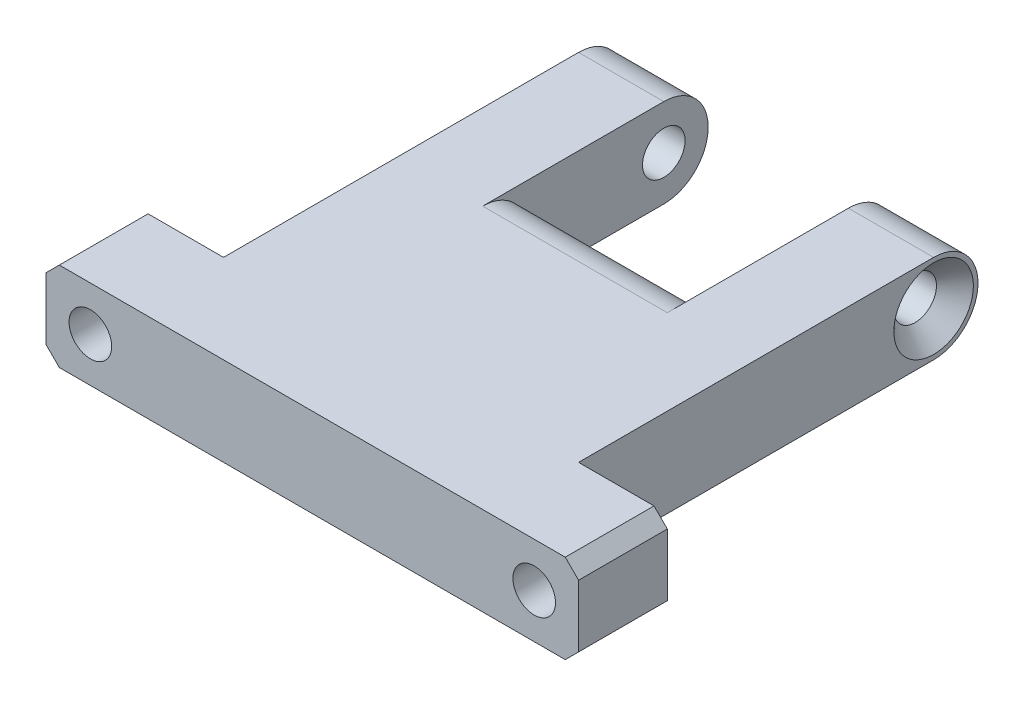
ISO-10303-21;
HEADER;
FILE_DESCRIPTION(('STEP AP214'),'2;1');
FILE_NAME('part.step','',(''),(''),'','','');
FILE_SCHEMA(('AUTOMOTIVE_DESIGN { 1 0 10303 214 1 1 1 1 }'));
ENDSEC;
DATA;
#1=APPLICATION_CONTEXT('core data for automotive mechanical design processes');
#2=APPLICATION_PROTOCOL_DEFINITION('international standard','automotive_design',2000,#1);
#3=PRODUCT_CONTEXT('',#1,'mechanical');
#4=PRODUCT('Part','Part','',(#3));
#5=PRODUCT_RELATED_PRODUCT_CATEGORY('part','',(#4));
#6=PRODUCT_DEFINITION_FORMATION('','',#4);
#7=PRODUCT_DEFINITION_CONTEXT('part definition',#1,'design');
#8=PRODUCT_DEFINITION('design','',#6,#7);
#9=PRODUCT_DEFINITION_SHAPE('','',#8);
#10=(LENGTH_UNIT() NAMED_UNIT(*) SI_UNIT(.MILLI.,.METRE.));
#11=(NAMED_UNIT(*) PLANE_ANGLE_UNIT() SI_UNIT($,.RADIAN.));
#12=(NAMED_UNIT(*) SI_UNIT($,.STERADIAN.) SOLID_ANGLE_UNIT());
#13=UNCERTAINTY_MEASURE_WITH_UNIT(LENGTH_MEASURE(1.E-05),#10,'distance_accuracy_value','');
#14=(GEOMETRIC_REPRESENTATION_CONTEXT(3) GLOBAL_UNCERTAINTY_ASSIGNED_CONTEXT((#13)) GLOBAL_UNIT_ASSIGNED_CONTEXT((#10,
#11,#12)) REPRESENTATION_CONTEXT('',''));
#15=CARTESIAN_POINT('',(0.,0.,0.));
#16=DIRECTION('',(0.,0.,1.));
#17=DIRECTION('',(1.,0.,0.));
#18=AXIS2_PLACEMENT_3D('',#15,#16,#17);
#19=CARTESIAN_POINT('',(-20.,10.,0.));
#20=DIRECTION('',(1.,0.,0.));
#21=DIRECTION('',(0.,0.,-1.));
#22=AXIS2_PLACEMENT_3D('',#19,#20,#21);
#23=PLANE('',#22);
#24=CARTESIAN_POINT('',(-20.,5.,-22.5));
#25=DIRECTION('',(1.,0.,0.));
#26=DIRECTION('',(0.,0.,-1.));
#27=AXIS2_PLACEMENT_3D('',#24,#25,#26);
#28=CIRCLE('',#27,5.);
#29=CARTESIAN_POINT('',(-20.,10.,-22.5));
#30=VERTEX_POINT('',#29);
#31=CARTESIAN_POINT('',(-20.,5.,-27.5));
#32=VERTEX_POINT('',#31);
#33=EDGE_CURVE('E241',#30,#32,#28,.F.);
#34=ORIENTED_EDGE('',*,*,#33,.T.);
#35=CARTESIAN_POINT('',(-20.,5.,-22.5));
#36=DIRECTION('',(1.,0.,0.));
#37=DIRECTION('',(0.,0.,-1.));
#38=AXIS2_PLACEMENT_3D('',#35,#36,#37);
#39=CIRCLE('',#38,5.);
#40=CARTESIAN_POINT('',(-20.,0.,-22.5));
#41=VERTEX_POINT('',#40);
#42=EDGE_CURVE('E244',#32,#41,#39,.F.);
#43=ORIENTED_EDGE('',*,*,#42,.T.);
#44=DIRECTION('',(0.,0.,1.));
#45=VECTOR('',#44,1.);
#46=CARTESIAN_POINT('',(-20.,0.,0.));
#47=LINE('',#46,#45);
#48=CARTESIAN_POINT('',(-20.,0.,17.5));
#49=VERTEX_POINT('',#48);
#50=EDGE_CURVE('E204',#41,#49,#47,.T.);
#51=ORIENTED_EDGE('',*,*,#50,.T.);
#52=DIRECTION('',(0.,-1.,0.));
#53=VECTOR('',#52,1.);
#54=CARTESIAN_POINT('',(-20.,10.,17.5));
#55=LINE('',#54,#53);
#56=CARTESIAN_POINT('',(-20.,10.,17.5));
#57=VERTEX_POINT('',#56);
#58=EDGE_CURVE('E183',#57,#49,#55,.T.);
#59=ORIENTED_EDGE('',*,*,#58,.F.);
#60=DIRECTION('',(0.,0.,1.));
#61=VECTOR('',#60,1.);
#62=CARTESIAN_POINT('',(-20.,10.,0.));
#63=LINE('',#62,#61);
#64=EDGE_CURVE('E189',#30,#57,#63,.T.);
#65=ORIENTED_EDGE('',*,*,#64,.F.);
#66=EDGE_LOOP('',(#34,#43,#51,#59,#65));
#67=FACE_BOUND('',#66,.T.);
#68=CARTESIAN_POINT('',(-20.,5.,-22.5));
#69=DIRECTION('',(-1.,0.,0.));
#70=DIRECTION('',(0.,0.,1.));
#71=AXIS2_PLACEMENT_3D('',#68,#69,#70);
#72=CIRCLE('',#71,4.48);
#73=CARTESIAN_POINT('',(-20.,5.,-18.02));
#74=VERTEX_POINT('',#73);
#75=EDGE_CURVE('E451',#74,#74,#72,.T.);
#76=ORIENTED_EDGE('',*,*,#75,.F.);
#77=EDGE_LOOP('',(#76));
#78=FACE_BOUND('',#77,.T.);
#79=ADVANCED_FACE('F43',(#67,#78),#23,.F.);
#80=CARTESIAN_POINT('',(0.,10.,17.5));
#81=DIRECTION('',(0.,0.,1.));
#82=DIRECTION('',(1.,0.,0.));
#83=AXIS2_PLACEMENT_3D('',#80,#81,#82);
#84=PLANE('',#83);
#85=DIRECTION('',(-1.,0.,0.));
#86=VECTOR('',#85,1.);
#87=CARTESIAN_POINT('',(0.,10.,17.5));
#88=LINE('',#87,#86);
#89=CARTESIAN_POINT('',(28.5,10.,17.5));
#90=VERTEX_POINT('',#89);
#91=CARTESIAN_POINT('',(20.,10.,17.5));
#92=VERTEX_POINT('',#91);
#93=EDGE_CURVE('E414',#90,#92,#88,.T.);
#94=ORIENTED_EDGE('',*,*,#93,.F.);
#95=DIRECTION('',(0.707106781186544,-0.707106781186551,0.));
#96=VECTOR('',#95,1.);
#97=CARTESIAN_POINT('',(28.5,10.,17.5));
#98=LINE('',#97,#96);
#99=CARTESIAN_POINT('',(30.,8.49999999999999,17.5));
#100=VERTEX_POINT('',#99);
#101=EDGE_CURVE('E68',#90,#100,#98,.T.);
#102=ORIENTED_EDGE('',*,*,#101,.T.);
#103=DIRECTION('',(0.,-1.,0.));
#104=VECTOR('',#103,1.);
#105=CARTESIAN_POINT('',(30.,10.,17.5));
#106=LINE('',#105,#104);
#107=CARTESIAN_POINT('',(30.,1.5,17.5));
#108=VERTEX_POINT('',#107);
#109=EDGE_CURVE('E331',#100,#108,#106,.T.);
#110=ORIENTED_EDGE('',*,*,#109,.T.);
#111=DIRECTION('',(0.707106781186549,0.707106781186546,0.));
#112=VECTOR('',#111,1.);
#113=CARTESIAN_POINT('',(30.,1.5,17.5));
#114=LINE('',#113,#112);
#115=CARTESIAN_POINT('',(28.5,0.,17.5));
#116=VERTEX_POINT('',#115);
#117=EDGE_CURVE('E60',#108,#116,#114,.F.);
#118=ORIENTED_EDGE('',*,*,#117,.T.);
#119=DIRECTION('',(-1.,0.,0.));
#120=VECTOR('',#119,1.);
#121=CARTESIAN_POINT('',(0.,0.,17.5));
#122=LINE('',#121,#120);
#123=CARTESIAN_POINT('',(20.,0.,17.5));
#124=VERTEX_POINT('',#123);
#125=EDGE_CURVE('E373',#116,#124,#122,.T.);
#126=ORIENTED_EDGE('',*,*,#125,.T.);
#127=DIRECTION('',(0.,-1.,0.));
#128=VECTOR('',#127,1.);
#129=CARTESIAN_POINT('',(20.,10.,17.5));
#130=LINE('',#129,#128);
#131=EDGE_CURVE('E340',#92,#124,#130,.T.);
#132=ORIENTED_EDGE('',*,*,#131,.F.);
#133=EDGE_LOOP('',(#94,#102,#110,#118,#126,#132));
#134=FACE_BOUND('',#133,.T.);
#135=CARTESIAN_POINT('',(25.,5.,17.5));
#136=DIRECTION('',(0.,0.,-1.));
#137=DIRECTION('',(-1.,0.,0.));
#138=AXIS2_PLACEMENT_3D('',#135,#136,#137);
#139=CIRCLE('',#138,4.48);
#140=CARTESIAN_POINT('',(20.52,5.,17.5));
#141=VERTEX_POINT('',#140);
#142=EDGE_CURVE('E439',#141,#141,#139,.T.);
#143=ORIENTED_EDGE('',*,*,#142,.F.);
#144=EDGE_LOOP('',(#143));
#145=FACE_BOUND('',#144,.T.);
#146=ADVANCED_FACE('F336',(#134,#145),#84,.F.);
#147=CARTESIAN_POINT('',(0.,10.,17.5));
#148=DIRECTION('',(0.,0.,-1.));
#149=DIRECTION('',(-1.,0.,0.));
#150=AXIS2_PLACEMENT_3D('',#147,#148,#149);
#151=PLANE('',#150);
#152=CARTESIAN_POINT('',(-25.,5.,17.5));
#153=DIRECTION('',(0.,0.,-1.));
#154=DIRECTION('',(-1.,0.,0.));
#155=AXIS2_PLACEMENT_3D('',#152,#153,#154);
#156=CIRCLE('',#155,4.48);
#157=CARTESIAN_POINT('',(-29.48,5.,17.5));
#158=VERTEX_POINT('',#157);
#159=EDGE_CURVE('E427',#158,#158,#156,.T.);
#160=ORIENTED_EDGE('',*,*,#159,.F.);
#161=EDGE_LOOP('',(#160));
#162=FACE_BOUND('',#161,.T.);
#163=DIRECTION('',(0.,-1.,0.));
#164=VECTOR('',#163,1.);
#165=CARTESIAN_POINT('',(-30.,10.,17.5));
#166=LINE('',#165,#164);
#167=CARTESIAN_POINT('',(-30.,8.50000000000001,17.5));
#168=VERTEX_POINT('',#167);
#169=CARTESIAN_POINT('',(-30.,1.50000000000001,17.5));
#170=VERTEX_POINT('',#169);
#171=EDGE_CURVE('E207',#168,#170,#166,.T.);
#172=ORIENTED_EDGE('',*,*,#171,.F.);
#173=DIRECTION('',(-0.707106781186549,-0.707106781186546,0.));
#174=VECTOR('',#173,1.);
#175=CARTESIAN_POINT('',(-14.2499999999999,24.25,17.5));
#176=LINE('',#175,#174);
#177=CARTESIAN_POINT('',(-28.5,10.,17.5));
#178=VERTEX_POINT('',#177);
#179=EDGE_CURVE('E184',#168,#178,#176,.F.);
#180=ORIENTED_EDGE('',*,*,#179,.T.);
#181=DIRECTION('',(1.,0.,0.));
#182=VECTOR('',#181,1.);
#183=CARTESIAN_POINT('',(0.,10.,17.5));
#184=LINE('',#183,#182);
#185=EDGE_CURVE('E177',#178,#57,#184,.T.);
#186=ORIENTED_EDGE('',*,*,#185,.T.);
#187=ORIENTED_EDGE('',*,*,#58,.T.);
#188=DIRECTION('',(1.,0.,0.));
#189=VECTOR('',#188,1.);
#190=CARTESIAN_POINT('',(0.,0.,17.5));
#191=LINE('',#190,#189);
#192=CARTESIAN_POINT('',(-28.5,0.,17.5));
#193=VERTEX_POINT('',#192);
#194=EDGE_CURVE('E367',#193,#49,#191,.T.);
#195=ORIENTED_EDGE('',*,*,#194,.F.);
#196=DIRECTION('',(-0.707106781186544,0.707106781186551,0.));
#197=VECTOR('',#196,1.);
#198=CARTESIAN_POINT('',(-19.2500000000001,-9.24999999999996,17.5));
#199=LINE('',#198,#197);
#200=EDGE_CURVE('E293',#193,#170,#199,.T.);
#201=ORIENTED_EDGE('',*,*,#200,.T.);
#202=EDGE_LOOP('',(#172,#180,#186,#187,#195,#201));
#203=FACE_BOUND('',#202,.T.);
#204=ADVANCED_FACE('F180',(#162,#203),#151,.T.);
#205=CARTESIAN_POINT('',(-30.,10.,0.));
#206=DIRECTION('',(-1.,0.,0.));
#207=DIRECTION('',(0.,0.,1.));
#208=AXIS2_PLACEMENT_3D('',#205,#206,#207);
#209=PLANE('',#208);
#210=DIRECTION('',(0.,-1.,0.));
#211=VECTOR('',#210,1.);
#212=CARTESIAN_POINT('',(-30.,10.,27.5));
#213=LINE('',#212,#211);
#214=CARTESIAN_POINT('',(-30.,8.50000000000001,27.5));
#215=VERTEX_POINT('',#214);
#216=CARTESIAN_POINT('',(-30.,1.50000000000001,27.5));
#217=VERTEX_POINT('',#216);
#218=EDGE_CURVE('E213',#215,#217,#213,.T.);
#219=ORIENTED_EDGE('',*,*,#218,.F.);
#220=DIRECTION('',(0.,0.,-1.));
#221=VECTOR('',#220,1.);
#222=CARTESIAN_POINT('',(-30.,8.50000000000001,0.));
#223=LINE('',#222,#221);
#224=EDGE_CURVE('E289',#215,#168,#223,.T.);
#225=ORIENTED_EDGE('',*,*,#224,.T.);
#226=ORIENTED_EDGE('',*,*,#171,.T.);
#227=DIRECTION('',(0.,0.,1.));
#228=VECTOR('',#227,1.);
#229=CARTESIAN_POINT('',(-30.,1.50000000000001,27.5));
#230=LINE('',#229,#228);
#231=EDGE_CURVE('E273',#170,#217,#230,.T.);
#232=ORIENTED_EDGE('',*,*,#231,.T.);
#233=EDGE_LOOP('',(#219,#225,#226,#232));
#234=FACE_BOUND('',#233,.T.);
#235=ADVANCED_FACE('F570',(#234),#209,.T.);
#236=CARTESIAN_POINT('',(0.,10.,27.5));
#237=DIRECTION('',(0.,0.,-1.));
#238=DIRECTION('',(-1.,0.,0.));
#239=AXIS2_PLACEMENT_3D('',#236,#237,#238);
#240=PLANE('',#239);
#241=CARTESIAN_POINT('',(25.,5.,27.5));
#242=DIRECTION('',(0.,0.,-1.));
#243=DIRECTION('',(-1.,0.,0.));
#244=AXIS2_PLACEMENT_3D('',#241,#242,#243);
#245=CIRCLE('',#244,2.4);
#246=CARTESIAN_POINT('',(22.6,5.,27.5));
#247=VERTEX_POINT('',#246);
#248=EDGE_CURVE('E431',#247,#247,#245,.T.);
#249=ORIENTED_EDGE('',*,*,#248,.T.);
#250=EDGE_LOOP('',(#249));
#251=FACE_BOUND('',#250,.T.);
#252=CARTESIAN_POINT('',(-25.,5.,27.5));
#253=DIRECTION('',(0.,0.,-1.));
#254=DIRECTION('',(-1.,0.,0.));
#255=AXIS2_PLACEMENT_3D('',#252,#253,#254);
#256=CIRCLE('',#255,2.4);
#257=CARTESIAN_POINT('',(-27.4,5.,27.5));
#258=VERTEX_POINT('',#257);
#259=EDGE_CURVE('E286',#258,#258,#256,.T.);
#260=ORIENTED_EDGE('',*,*,#259,.T.);
#261=EDGE_LOOP('',(#260));
#262=FACE_BOUND('',#261,.T.);
#263=DIRECTION('',(1.,0.,0.));
#264=VECTOR('',#263,1.);
#265=CARTESIAN_POINT('',(0.,10.,27.5));
#266=LINE('',#265,#264);
#267=CARTESIAN_POINT('',(-28.5,10.,27.5));
#268=VERTEX_POINT('',#267);
#269=CARTESIAN_POINT('',(28.5,10.,27.5));
#270=VERTEX_POINT('',#269);
#271=EDGE_CURVE('E188',#268,#270,#266,.T.);
#272=ORIENTED_EDGE('',*,*,#271,.F.);
#273=DIRECTION('',(0.707106781186549,0.707106781186546,0.));
#274=VECTOR('',#273,1.);
#275=CARTESIAN_POINT('',(-30.,8.50000000000001,27.5));
#276=LINE('',#275,#274);
#277=EDGE_CURVE('E314',#268,#215,#276,.F.);
#278=ORIENTED_EDGE('',*,*,#277,.T.);
#279=ORIENTED_EDGE('',*,*,#218,.T.);
#280=DIRECTION('',(0.707106781186544,-0.707106781186551,0.));
#281=VECTOR('',#280,1.);
#282=CARTESIAN_POINT('',(-28.5,0.,27.5));
#283=LINE('',#282,#281);
#284=CARTESIAN_POINT('',(-28.5,0.,27.5));
#285=VERTEX_POINT('',#284);
#286=EDGE_CURVE('E311',#217,#285,#283,.T.);
#287=ORIENTED_EDGE('',*,*,#286,.T.);
#288=DIRECTION('',(1.,0.,0.));
#289=VECTOR('',#288,1.);
#290=CARTESIAN_POINT('',(0.,0.,27.5));
#291=LINE('',#290,#289);
#292=CARTESIAN_POINT('',(28.5,0.,27.5));
#293=VERTEX_POINT('',#292);
#294=EDGE_CURVE('E368',#285,#293,#291,.T.);
#295=ORIENTED_EDGE('',*,*,#294,.T.);
#296=DIRECTION('',(-0.707106781186549,-0.707106781186546,0.));
#297=VECTOR('',#296,1.);
#298=CARTESIAN_POINT('',(30.,1.5,27.5));
#299=LINE('',#298,#297);
#300=CARTESIAN_POINT('',(30.,1.5,27.5));
#301=VERTEX_POINT('',#300);
#302=EDGE_CURVE('E305',#293,#301,#299,.F.);
#303=ORIENTED_EDGE('',*,*,#302,.T.);
#304=DIRECTION('',(0.,-1.,0.));
#305=VECTOR('',#304,1.);
#306=CARTESIAN_POINT('',(30.,10.,27.5));
#307=LINE('',#306,#305);
#308=CARTESIAN_POINT('',(30.,8.49999999999999,27.5));
#309=VERTEX_POINT('',#308);
#310=EDGE_CURVE('E334',#309,#301,#307,.T.);
#311=ORIENTED_EDGE('',*,*,#310,.F.);
#312=DIRECTION('',(-0.707106781186544,0.707106781186551,0.));
#313=VECTOR('',#312,1.);
#314=CARTESIAN_POINT('',(28.5,10.,27.5));
#315=LINE('',#314,#313);
#316=EDGE_CURVE('E308',#309,#270,#315,.T.);
#317=ORIENTED_EDGE('',*,*,#316,.T.);
#318=EDGE_LOOP('',(#272,#278,#279,#287,#295,#303,#311,#317));
#319=FACE_BOUND('',#318,.T.);
#320=ADVANCED_FACE('F355',(#251,#262,#319),#240,.F.);
#321=CARTESIAN_POINT('',(30.,10.,0.));
#322=DIRECTION('',(-1.,0.,0.));
#323=DIRECTION('',(0.,0.,1.));
#324=AXIS2_PLACEMENT_3D('',#321,#322,#323);
#325=PLANE('',#324);
#326=ORIENTED_EDGE('',*,*,#109,.F.);
#327=DIRECTION('',(0.,0.,1.));
#328=VECTOR('',#327,1.);
#329=CARTESIAN_POINT('',(30.,8.49999999999999,27.5));
#330=LINE('',#329,#328);
#331=EDGE_CURVE('E11',#100,#309,#330,.T.);
#332=ORIENTED_EDGE('',*,*,#331,.T.);
#333=ORIENTED_EDGE('',*,*,#310,.T.);
#334=DIRECTION('',(0.,0.,-1.));
#335=VECTOR('',#334,1.);
#336=CARTESIAN_POINT('',(30.,1.5,0.));
#337=LINE('',#336,#335);
#338=EDGE_CURVE('E53',#301,#108,#337,.T.);
#339=ORIENTED_EDGE('',*,*,#338,.T.);
#340=EDGE_LOOP('',(#326,#332,#333,#339));
#341=FACE_BOUND('',#340,.T.);
#342=ADVANCED_FACE('F330',(#341),#325,.F.);
#343=CARTESIAN_POINT('',(20.,10.,0.));
#344=DIRECTION('',(1.,0.,0.));
#345=DIRECTION('',(0.,0.,-1.));
#346=AXIS2_PLACEMENT_3D('',#343,#344,#345);
#347=PLANE('',#346);
#348=CARTESIAN_POINT('',(20.,5.,-22.5));
#349=DIRECTION('',(1.,0.,0.));
#350=DIRECTION('',(0.,0.,-1.));
#351=AXIS2_PLACEMENT_3D('',#348,#349,#350);
#352=CIRCLE('',#351,4.48);
#353=CARTESIAN_POINT('',(20.,5.,-26.98));
#354=VERTEX_POINT('',#353);
#355=EDGE_CURVE('E463',#354,#354,#352,.T.);
#356=ORIENTED_EDGE('',*,*,#355,.F.);
#357=EDGE_LOOP('',(#356));
#358=FACE_BOUND('',#357,.T.);
#359=DIRECTION('',(0.,0.,1.));
#360=VECTOR('',#359,1.);
#361=CARTESIAN_POINT('',(20.,0.,0.));
#362=LINE('',#361,#360);
#363=CARTESIAN_POINT('',(20.,0.,-22.5));
#364=VERTEX_POINT('',#363);
#365=EDGE_CURVE('E380',#364,#124,#362,.T.);
#366=ORIENTED_EDGE('',*,*,#365,.F.);
#367=CARTESIAN_POINT('',(20.,5.,-22.5));
#368=DIRECTION('',(1.,0.,0.));
#369=DIRECTION('',(0.,0.,-1.));
#370=AXIS2_PLACEMENT_3D('',#367,#368,#369);
#371=CIRCLE('',#370,5.);
#372=CARTESIAN_POINT('',(20.,5.,-27.5));
#373=VERTEX_POINT('',#372);
#374=EDGE_CURVE('E250',#364,#373,#371,.T.);
#375=ORIENTED_EDGE('',*,*,#374,.T.);
#376=CARTESIAN_POINT('',(20.,5.,-22.5));
#377=DIRECTION('',(1.,0.,0.));
#378=DIRECTION('',(0.,0.,-1.));
#379=AXIS2_PLACEMENT_3D('',#376,#377,#378);
#380=CIRCLE('',#379,5.);
#381=CARTESIAN_POINT('',(20.,10.,-22.5));
#382=VERTEX_POINT('',#381);
#383=EDGE_CURVE('E247',#373,#382,#380,.T.);
#384=ORIENTED_EDGE('',*,*,#383,.T.);
#385=DIRECTION('',(0.,0.,1.));
#386=VECTOR('',#385,1.);
#387=CARTESIAN_POINT('',(20.,10.,0.));
#388=LINE('',#387,#386);
#389=EDGE_CURVE('E408',#382,#92,#388,.T.);
#390=ORIENTED_EDGE('',*,*,#389,.T.);
#391=ORIENTED_EDGE('',*,*,#131,.T.);
#392=EDGE_LOOP('',(#366,#375,#384,#390,#391));
#393=FACE_BOUND('',#392,.T.);
#394=ADVANCED_FACE('F470',(#358,#393),#347,.T.);
#395=CARTESIAN_POINT('',(10.4,10.,0.));
#396=DIRECTION('',(-1.,0.,0.));
#397=DIRECTION('',(0.,0.,1.));
#398=AXIS2_PLACEMENT_3D('',#395,#396,#397);
#399=PLANE('',#398);
#400=CARTESIAN_POINT('',(10.4,5.,-22.5));
#401=DIRECTION('',(-1.,0.,0.));
#402=DIRECTION('',(0.,0.,1.));
#403=AXIS2_PLACEMENT_3D('',#400,#401,#402);
#404=CIRCLE('',#403,2.39999999999999);
#405=CARTESIAN_POINT('',(10.4,5.,-20.1));
#406=VERTEX_POINT('',#405);
#407=EDGE_CURVE('E455',#406,#406,#404,.T.);
#408=ORIENTED_EDGE('',*,*,#407,.F.);
#409=EDGE_LOOP('',(#408));
#410=FACE_BOUND('',#409,.T.);
#411=CARTESIAN_POINT('',(10.4,5.,-22.5));
#412=DIRECTION('',(-1.,0.,0.));
#413=DIRECTION('',(0.,0.,1.));
#414=AXIS2_PLACEMENT_3D('',#411,#412,#413);
#415=CIRCLE('',#414,5.);
#416=CARTESIAN_POINT('',(10.4,10.,-22.5));
#417=VERTEX_POINT('',#416);
#418=CARTESIAN_POINT('',(10.4,5.,-27.5));
#419=VERTEX_POINT('',#418);
#420=EDGE_CURVE('E253',#417,#419,#415,.T.);
#421=ORIENTED_EDGE('',*,*,#420,.T.);
#422=CARTESIAN_POINT('',(10.4,5.,-22.5));
#423=DIRECTION('',(-1.,0.,0.));
#424=DIRECTION('',(0.,0.,1.));
#425=AXIS2_PLACEMENT_3D('',#422,#423,#424);
#426=CIRCLE('',#425,5.);
#427=CARTESIAN_POINT('',(10.4,0.,-22.5));
#428=VERTEX_POINT('',#427);
#429=EDGE_CURVE('E256',#419,#428,#426,.T.);
#430=ORIENTED_EDGE('',*,*,#429,.T.);
#431=DIRECTION('',(0.,0.,-1.));
#432=VECTOR('',#431,1.);
#433=CARTESIAN_POINT('',(10.4,0.,0.));
#434=LINE('',#433,#432);
#435=CARTESIAN_POINT('',(10.4,0.,-2.10000000000001));
#436=VERTEX_POINT('',#435);
#437=EDGE_CURVE('E384',#436,#428,#434,.T.);
#438=ORIENTED_EDGE('',*,*,#437,.F.);
#439=CARTESIAN_POINT('',(10.4,5.,-2.10000000000001));
#440=DIRECTION('',(-1.,0.,0.));
#441=DIRECTION('',(0.,0.,1.));
#442=AXIS2_PLACEMENT_3D('',#439,#440,#441);
#443=CIRCLE('',#442,5.);
#444=CARTESIAN_POINT('',(10.4,5.,-7.10000000000001));
#445=VERTEX_POINT('',#444);
#446=EDGE_CURVE('E266',#436,#445,#443,.F.);
#447=ORIENTED_EDGE('',*,*,#446,.T.);
#448=CARTESIAN_POINT('',(10.4,5.,-2.10000000000001));
#449=DIRECTION('',(-1.,0.,0.));
#450=DIRECTION('',(0.,0.,1.));
#451=AXIS2_PLACEMENT_3D('',#448,#449,#450);
#452=CIRCLE('',#451,5.);
#453=CARTESIAN_POINT('',(10.4,10.,-2.10000000000001));
#454=VERTEX_POINT('',#453);
#455=EDGE_CURVE('E259',#445,#454,#452,.F.);
#456=ORIENTED_EDGE('',*,*,#455,.T.);
#457=DIRECTION('',(0.,0.,-1.));
#458=VECTOR('',#457,1.);
#459=CARTESIAN_POINT('',(10.4,10.,0.));
#460=LINE('',#459,#458);
#461=EDGE_CURVE('E405',#454,#417,#460,.T.);
#462=ORIENTED_EDGE('',*,*,#461,.T.);
#463=EDGE_LOOP('',(#421,#430,#438,#447,#456,#462));
#464=FACE_BOUND('',#463,.T.);
#465=ADVANCED_FACE('F473',(#410,#464),#399,.T.);
#466=CARTESIAN_POINT('',(-10.4,10.,0.));
#467=DIRECTION('',(-1.,0.,0.));
#468=DIRECTION('',(0.,0.,1.));
#469=AXIS2_PLACEMENT_3D('',#466,#467,#468);
#470=PLANE('',#469);
#471=CARTESIAN_POINT('',(-10.4,5.,-22.5));
#472=DIRECTION('',(-1.,0.,0.));
#473=DIRECTION('',(0.,0.,1.));
#474=AXIS2_PLACEMENT_3D('',#471,#472,#473);
#475=CIRCLE('',#474,2.39999999999999);
#476=CARTESIAN_POINT('',(-10.4,5.,-20.1));
#477=VERTEX_POINT('',#476);
#478=EDGE_CURVE('E443',#477,#477,#475,.T.);
#479=ORIENTED_EDGE('',*,*,#478,.T.);
#480=EDGE_LOOP('',(#479));
#481=FACE_BOUND('',#480,.T.);
#482=DIRECTION('',(0.,0.,-1.));
#483=VECTOR('',#482,1.);
#484=CARTESIAN_POINT('',(-10.4,0.,0.));
#485=LINE('',#484,#483);
#486=CARTESIAN_POINT('',(-10.4,0.,-2.10000000000001));
#487=VERTEX_POINT('',#486);
#488=CARTESIAN_POINT('',(-10.4,0.,-22.5));
#489=VERTEX_POINT('',#488);
#490=EDGE_CURVE('E199',#487,#489,#485,.T.);
#491=ORIENTED_EDGE('',*,*,#490,.T.);
#492=CARTESIAN_POINT('',(-10.4,5.,-22.5));
#493=DIRECTION('',(-1.,0.,0.));
#494=DIRECTION('',(0.,0.,1.));
#495=AXIS2_PLACEMENT_3D('',#492,#493,#494);
#496=CIRCLE('',#495,5.);
#497=CARTESIAN_POINT('',(-10.4,5.,-27.5));
#498=VERTEX_POINT('',#497);
#499=EDGE_CURVE('E238',#489,#498,#496,.F.);
#500=ORIENTED_EDGE('',*,*,#499,.T.);
#501=CARTESIAN_POINT('',(-10.4,5.,-22.5));
#502=DIRECTION('',(-1.,0.,0.));
#503=DIRECTION('',(0.,0.,1.));
#504=AXIS2_PLACEMENT_3D('',#501,#502,#503);
#505=CIRCLE('',#504,5.);
#506=CARTESIAN_POINT('',(-10.4,10.,-22.5));
#507=VERTEX_POINT('',#506);
#508=EDGE_CURVE('E235',#498,#507,#505,.F.);
#509=ORIENTED_EDGE('',*,*,#508,.T.);
#510=DIRECTION('',(0.,0.,-1.));
#511=VECTOR('',#510,1.);
#512=CARTESIAN_POINT('',(-10.4,10.,0.));
#513=LINE('',#512,#511);
#514=CARTESIAN_POINT('',(-10.4,10.,-2.10000000000001));
#515=VERTEX_POINT('',#514);
#516=EDGE_CURVE('E346',#515,#507,#513,.T.);
#517=ORIENTED_EDGE('',*,*,#516,.F.);
#518=CARTESIAN_POINT('',(-10.4,5.,-2.10000000000001));
#519=DIRECTION('',(-1.,0.,0.));
#520=DIRECTION('',(0.,0.,1.));
#521=AXIS2_PLACEMENT_3D('',#518,#519,#520);
#522=CIRCLE('',#521,5.);
#523=CARTESIAN_POINT('',(-10.4,5.,-7.10000000000001));
#524=VERTEX_POINT('',#523);
#525=EDGE_CURVE('E263',#515,#524,#522,.T.);
#526=ORIENTED_EDGE('',*,*,#525,.T.);
#527=CARTESIAN_POINT('',(-10.4,5.,-2.10000000000001));
#528=DIRECTION('',(-1.,0.,0.));
#529=DIRECTION('',(0.,0.,1.));
#530=AXIS2_PLACEMENT_3D('',#527,#528,#529);
#531=CIRCLE('',#530,5.);
#532=EDGE_CURVE('E269',#524,#487,#531,.T.);
#533=ORIENTED_EDGE('',*,*,#532,.T.);
#534=EDGE_LOOP('',(#491,#500,#509,#517,#526,#533));
#535=FACE_BOUND('',#534,.T.);
#536=ADVANCED_FACE('F390',(#481,#535),#470,.F.);
#537=CARTESIAN_POINT('',(0.,10.,0.));
#538=DIRECTION('',(0.,1.,0.));
#539=DIRECTION('',(0.,0.,1.));
#540=AXIS2_PLACEMENT_3D('',#537,#538,#539);
#541=PLANE('',#540);
#542=ORIENTED_EDGE('',*,*,#185,.F.);
#543=DIRECTION('',(0.,0.,1.));
#544=VECTOR('',#543,1.);
#545=CARTESIAN_POINT('',(-28.5,10.,0.));
#546=LINE('',#545,#544);
#547=EDGE_CURVE('E302',#178,#268,#546,.T.);
#548=ORIENTED_EDGE('',*,*,#547,.T.);
#549=ORIENTED_EDGE('',*,*,#271,.T.);
#550=DIRECTION('',(0.,0.,-1.));
#551=VECTOR('',#550,1.);
#552=CARTESIAN_POINT('',(28.5,10.,17.5));
#553=LINE('',#552,#551);
#554=EDGE_CURVE('E298',#270,#90,#553,.T.);
#555=ORIENTED_EDGE('',*,*,#554,.T.);
#556=ORIENTED_EDGE('',*,*,#93,.T.);
#557=ORIENTED_EDGE('',*,*,#389,.F.);
#558=DIRECTION('',(1.,0.,0.));
#559=VECTOR('',#558,1.);
#560=CARTESIAN_POINT('',(0.,10.,-22.5));
#561=LINE('',#560,#559);
#562=EDGE_CURVE('E206',#382,#417,#561,.F.);
#563=ORIENTED_EDGE('',*,*,#562,.T.);
#564=ORIENTED_EDGE('',*,*,#461,.F.);
#565=DIRECTION('',(1.,0.,0.));
#566=VECTOR('',#565,1.);
#567=CARTESIAN_POINT('',(0.,10.,-2.10000000000001));
#568=LINE('',#567,#566);
#569=EDGE_CURVE('E219',#454,#515,#568,.F.);
#570=ORIENTED_EDGE('',*,*,#569,.T.);
#571=ORIENTED_EDGE('',*,*,#516,.T.);
#572=DIRECTION('',(1.,0.,0.));
#573=VECTOR('',#572,1.);
#574=CARTESIAN_POINT('',(0.,10.,-22.5));
#575=LINE('',#574,#573);
#576=EDGE_CURVE('E195',#507,#30,#575,.F.);
#577=ORIENTED_EDGE('',*,*,#576,.T.);
#578=ORIENTED_EDGE('',*,*,#64,.T.);
#579=EDGE_LOOP('',(#542,#548,#549,#555,#556,#557,#563,#564,#570,#571,#577,#578));
#580=FACE_BOUND('',#579,.T.);
#581=ADVANCED_FACE('F192',(#580),#541,.T.);
#582=CARTESIAN_POINT('',(0.,0.,0.));
#583=DIRECTION('',(0.,1.,0.));
#584=DIRECTION('',(0.,0.,1.));
#585=AXIS2_PLACEMENT_3D('',#582,#583,#584);
#586=PLANE('',#585);
#587=ORIENTED_EDGE('',*,*,#294,.F.);
#588=DIRECTION('',(0.,0.,-1.));
#589=VECTOR('',#588,1.);
#590=CARTESIAN_POINT('',(-28.5,0.,17.5));
#591=LINE('',#590,#589);
#592=EDGE_CURVE('E320',#285,#193,#591,.T.);
#593=ORIENTED_EDGE('',*,*,#592,.T.);
#594=ORIENTED_EDGE('',*,*,#194,.T.);
#595=ORIENTED_EDGE('',*,*,#50,.F.);
#596=DIRECTION('',(1.,0.,0.));
#597=VECTOR('',#596,1.);
#598=CARTESIAN_POINT('',(-10.4,0.,-22.5));
#599=LINE('',#598,#597);
#600=EDGE_CURVE('E227',#41,#489,#599,.T.);
#601=ORIENTED_EDGE('',*,*,#600,.T.);
#602=ORIENTED_EDGE('',*,*,#490,.F.);
#603=DIRECTION('',(1.,0.,0.));
#604=VECTOR('',#603,1.);
#605=CARTESIAN_POINT('',(10.4,0.,-2.10000000000001));
#606=LINE('',#605,#604);
#607=EDGE_CURVE('E231',#487,#436,#606,.T.);
#608=ORIENTED_EDGE('',*,*,#607,.T.);
#609=ORIENTED_EDGE('',*,*,#437,.T.);
#610=DIRECTION('',(1.,0.,0.));
#611=VECTOR('',#610,1.);
#612=CARTESIAN_POINT('',(20.,0.,-22.5));
#613=LINE('',#612,#611);
#614=EDGE_CURVE('E223',#428,#364,#613,.T.);
#615=ORIENTED_EDGE('',*,*,#614,.T.);
#616=ORIENTED_EDGE('',*,*,#365,.T.);
#617=ORIENTED_EDGE('',*,*,#125,.F.);
#618=DIRECTION('',(0.,0.,1.));
#619=VECTOR('',#618,1.);
#620=CARTESIAN_POINT('',(28.5,0.,0.));
#621=LINE('',#620,#619);
#622=EDGE_CURVE('E317',#116,#293,#621,.T.);
#623=ORIENTED_EDGE('',*,*,#622,.T.);
#624=EDGE_LOOP('',(#587,#593,#594,#595,#601,#602,#608,#609,#615,#616,#617,#623));
#625=FACE_BOUND('',#624,.T.);
#626=ADVANCED_FACE('F366',(#625),#586,.F.);
#627=CARTESIAN_POINT('',(0.,5.,-2.10000000000001));
#628=DIRECTION('',(-1.,0.,0.));
#629=DIRECTION('',(0.,0.,1.));
#630=AXIS2_PLACEMENT_3D('',#627,#628,#629);
#631=CYLINDRICAL_SURFACE('',#630,5.);
#632=ORIENTED_EDGE('',*,*,#607,.F.);
#633=ORIENTED_EDGE('',*,*,#532,.F.);
#634=DIRECTION('',(1.,0.,0.));
#635=VECTOR('',#634,1.);
#636=CARTESIAN_POINT('',(-10.4,5.,-7.10000000000001));
#637=LINE('',#636,#635);
#638=EDGE_CURVE('E274',#445,#524,#637,.F.);
#639=ORIENTED_EDGE('',*,*,#638,.F.);
#640=ORIENTED_EDGE('',*,*,#446,.F.);
#641=EDGE_LOOP('',(#632,#633,#639,#640));
#642=FACE_BOUND('',#641,.T.);
#643=ADVANCED_FACE('F513',(#642),#631,.T.);
#644=CARTESIAN_POINT('',(0.,5.,-2.10000000000001));
#645=DIRECTION('',(1.,0.,0.));
#646=DIRECTION('',(0.,0.,-1.));
#647=AXIS2_PLACEMENT_3D('',#644,#645,#646);
#648=CYLINDRICAL_SURFACE('',#647,5.);
#649=ORIENTED_EDGE('',*,*,#525,.F.);
#650=ORIENTED_EDGE('',*,*,#569,.F.);
#651=ORIENTED_EDGE('',*,*,#455,.F.);
#652=ORIENTED_EDGE('',*,*,#638,.T.);
#653=EDGE_LOOP('',(#649,#650,#651,#652));
#654=FACE_BOUND('',#653,.T.);
#655=ADVANCED_FACE('F510',(#654),#648,.T.);
#656=CARTESIAN_POINT('',(0.,5.,-22.5));
#657=DIRECTION('',(1.,0.,0.));
#658=DIRECTION('',(0.,0.,-1.));
#659=AXIS2_PLACEMENT_3D('',#656,#657,#658);
#660=CYLINDRICAL_SURFACE('',#659,5.);
#661=DIRECTION('',(1.,0.,0.));
#662=VECTOR('',#661,1.);
#663=CARTESIAN_POINT('',(0.,5.,-27.5));
#664=LINE('',#663,#662);
#665=EDGE_CURVE('E278',#32,#498,#664,.T.);
#666=ORIENTED_EDGE('',*,*,#665,.F.);
#667=ORIENTED_EDGE('',*,*,#33,.F.);
#668=ORIENTED_EDGE('',*,*,#576,.F.);
#669=ORIENTED_EDGE('',*,*,#508,.F.);
#670=EDGE_LOOP('',(#666,#667,#668,#669));
#671=FACE_BOUND('',#670,.T.);
#672=ADVANCED_FACE('F401',(#671),#660,.T.);
#673=CARTESIAN_POINT('',(0.,5.,-22.5));
#674=DIRECTION('',(-1.,0.,0.));
#675=DIRECTION('',(0.,0.,1.));
#676=AXIS2_PLACEMENT_3D('',#673,#674,#675);
#677=CYLINDRICAL_SURFACE('',#676,5.);
#678=ORIENTED_EDGE('',*,*,#42,.F.);
#679=ORIENTED_EDGE('',*,*,#665,.T.);
#680=ORIENTED_EDGE('',*,*,#499,.F.);
#681=ORIENTED_EDGE('',*,*,#600,.F.);
#682=EDGE_LOOP('',(#678,#679,#680,#681));
#683=FACE_BOUND('',#682,.T.);
#684=ADVANCED_FACE('F398',(#683),#677,.T.);
#685=CARTESIAN_POINT('',(0.,5.,-22.5));
#686=DIRECTION('',(1.,0.,0.));
#687=DIRECTION('',(0.,0.,-1.));
#688=AXIS2_PLACEMENT_3D('',#685,#686,#687);
#689=CYLINDRICAL_SURFACE('',#688,5.);
#690=DIRECTION('',(1.,0.,0.));
#691=VECTOR('',#690,1.);
#692=CARTESIAN_POINT('',(0.,5.,-27.5));
#693=LINE('',#692,#691);
#694=EDGE_CURVE('E282',#419,#373,#693,.T.);
#695=ORIENTED_EDGE('',*,*,#694,.F.);
#696=ORIENTED_EDGE('',*,*,#420,.F.);
#697=ORIENTED_EDGE('',*,*,#562,.F.);
#698=ORIENTED_EDGE('',*,*,#383,.F.);
#699=EDGE_LOOP('',(#695,#696,#697,#698));
#700=FACE_BOUND('',#699,.T.);
#701=ADVANCED_FACE('F485',(#700),#689,.T.);
#702=CARTESIAN_POINT('',(0.,5.,-22.5));
#703=DIRECTION('',(-1.,0.,0.));
#704=DIRECTION('',(0.,0.,1.));
#705=AXIS2_PLACEMENT_3D('',#702,#703,#704);
#706=CYLINDRICAL_SURFACE('',#705,5.);
#707=ORIENTED_EDGE('',*,*,#429,.F.);
#708=ORIENTED_EDGE('',*,*,#694,.T.);
#709=ORIENTED_EDGE('',*,*,#374,.F.);
#710=ORIENTED_EDGE('',*,*,#614,.F.);
#711=EDGE_LOOP('',(#707,#708,#709,#710));
#712=FACE_BOUND('',#711,.T.);
#713=ADVANCED_FACE('F481',(#712),#706,.T.);
#714=CARTESIAN_POINT('',(-30.,8.50000000000001,0.));
#715=DIRECTION('',(0.707106781186546,-0.707106781186549,0.));
#716=DIRECTION('',(0.,0.,-1.));
#717=AXIS2_PLACEMENT_3D('',#714,#715,#716);
#718=PLANE('',#717);
#719=ORIENTED_EDGE('',*,*,#277,.F.);
#720=ORIENTED_EDGE('',*,*,#547,.F.);
#721=ORIENTED_EDGE('',*,*,#179,.F.);
#722=ORIENTED_EDGE('',*,*,#224,.F.);
#723=EDGE_LOOP('',(#719,#720,#721,#722));
#724=FACE_BOUND('',#723,.T.);
#725=ADVANCED_FACE('F524',(#724),#718,.F.);
#726=CARTESIAN_POINT('',(-28.5,0.,0.));
#727=DIRECTION('',(-0.707106781186551,-0.707106781186544,0.));
#728=DIRECTION('',(0.,0.,1.));
#729=AXIS2_PLACEMENT_3D('',#726,#727,#728);
#730=PLANE('',#729);
#731=ORIENTED_EDGE('',*,*,#286,.F.);
#732=ORIENTED_EDGE('',*,*,#231,.F.);
#733=ORIENTED_EDGE('',*,*,#200,.F.);
#734=ORIENTED_EDGE('',*,*,#592,.F.);
#735=EDGE_LOOP('',(#731,#732,#733,#734));
#736=FACE_BOUND('',#735,.T.);
#737=ADVANCED_FACE('F364',(#736),#730,.T.);
#738=CARTESIAN_POINT('',(28.5,10.,0.));
#739=DIRECTION('',(0.707106781186551,0.707106781186544,0.));
#740=DIRECTION('',(0.,0.,1.));
#741=AXIS2_PLACEMENT_3D('',#738,#739,#740);
#742=PLANE('',#741);
#743=ORIENTED_EDGE('',*,*,#316,.F.);
#744=ORIENTED_EDGE('',*,*,#331,.F.);
#745=ORIENTED_EDGE('',*,*,#101,.F.);
#746=ORIENTED_EDGE('',*,*,#554,.F.);
#747=EDGE_LOOP('',(#743,#744,#745,#746));
#748=FACE_BOUND('',#747,.T.);
#749=ADVANCED_FACE('F491',(#748),#742,.T.);
#750=CARTESIAN_POINT('',(30.,1.5,0.));
#751=DIRECTION('',(-0.707106781186546,0.707106781186549,0.));
#752=DIRECTION('',(0.,0.,-1.));
#753=AXIS2_PLACEMENT_3D('',#750,#751,#752);
#754=PLANE('',#753);
#755=ORIENTED_EDGE('',*,*,#302,.F.);
#756=ORIENTED_EDGE('',*,*,#622,.F.);
#757=ORIENTED_EDGE('',*,*,#117,.F.);
#758=ORIENTED_EDGE('',*,*,#338,.F.);
#759=EDGE_LOOP('',(#755,#756,#757,#758));
#760=FACE_BOUND('',#759,.T.);
#761=ADVANCED_FACE('F46',(#760),#754,.F.);
#762=CARTESIAN_POINT('',(-25.,5.,17.5));
#763=DIRECTION('',(0.,0.,-1.));
#764=DIRECTION('',(-1.,0.,0.));
#765=AXIS2_PLACEMENT_3D('',#762,#763,#764);
#766=CYLINDRICAL_SURFACE('',#765,2.4);
#767=ORIENTED_EDGE('',*,*,#259,.F.);
#768=EDGE_LOOP('',(#767));
#769=FACE_BOUND('',#768,.T.);
#770=CARTESIAN_POINT('',(-25.,5.,19.58));
#771=DIRECTION('',(0.,0.,-1.));
#772=DIRECTION('',(-1.,0.,0.));
#773=AXIS2_PLACEMENT_3D('',#770,#771,#772);
#774=CIRCLE('',#773,2.4);
#775=CARTESIAN_POINT('',(-27.4,5.,19.58));
#776=VERTEX_POINT('',#775);
#777=EDGE_CURVE('E423',#776,#776,#774,.T.);
#778=ORIENTED_EDGE('',*,*,#777,.T.);
#779=EDGE_LOOP('',(#778));
#780=FACE_BOUND('',#779,.T.);
#781=ADVANCED_FACE('F493',(#769,#780),#766,.F.);
#782=CARTESIAN_POINT('',(-25.,5.,17.5));
#783=DIRECTION('',(0.,0.,-1.));
#784=DIRECTION('',(-1.,0.,0.));
#785=AXIS2_PLACEMENT_3D('',#782,#783,#784);
#786=CONICAL_SURFACE('',#785,4.48,0.785398163397447);
#787=ORIENTED_EDGE('',*,*,#777,.F.);
#788=EDGE_LOOP('',(#787));
#789=FACE_BOUND('',#788,.T.);
#790=ORIENTED_EDGE('',*,*,#159,.T.);
#791=EDGE_LOOP('',(#790));
#792=FACE_BOUND('',#791,.T.);
#793=ADVANCED_FACE('F498',(#789,#792),#786,.F.);
#794=CARTESIAN_POINT('',(25.,5.,17.5));
#795=DIRECTION('',(0.,0.,-1.));
#796=DIRECTION('',(-1.,0.,0.));
#797=AXIS2_PLACEMENT_3D('',#794,#795,#796);
#798=CYLINDRICAL_SURFACE('',#797,2.4);
#799=ORIENTED_EDGE('',*,*,#248,.F.);
#800=EDGE_LOOP('',(#799));
#801=FACE_BOUND('',#800,.T.);
#802=CARTESIAN_POINT('',(25.,5.,19.58));
#803=DIRECTION('',(0.,0.,-1.));
#804=DIRECTION('',(-1.,0.,0.));
#805=AXIS2_PLACEMENT_3D('',#802,#803,#804);
#806=CIRCLE('',#805,2.4);
#807=CARTESIAN_POINT('',(22.6,5.,19.58));
#808=VERTEX_POINT('',#807);
#809=EDGE_CURVE('E435',#808,#808,#806,.T.);
#810=ORIENTED_EDGE('',*,*,#809,.T.);
#811=EDGE_LOOP('',(#810));
#812=FACE_BOUND('',#811,.T.);
#813=ADVANCED_FACE('F597',(#801,#812),#798,.F.);
#814=CARTESIAN_POINT('',(25.,5.,17.5));
#815=DIRECTION('',(0.,0.,-1.));
#816=DIRECTION('',(-1.,0.,0.));
#817=AXIS2_PLACEMENT_3D('',#814,#815,#816);
#818=CONICAL_SURFACE('',#817,4.48,0.785398163397447);
#819=ORIENTED_EDGE('',*,*,#809,.F.);
#820=EDGE_LOOP('',(#819));
#821=FACE_BOUND('',#820,.T.);
#822=ORIENTED_EDGE('',*,*,#142,.T.);
#823=EDGE_LOOP('',(#822));
#824=FACE_BOUND('',#823,.T.);
#825=ADVANCED_FACE('F607',(#821,#824),#818,.F.);
#826=CARTESIAN_POINT('',(-20.,5.,-22.5));
#827=DIRECTION('',(-1.,0.,0.));
#828=DIRECTION('',(0.,0.,1.));
#829=AXIS2_PLACEMENT_3D('',#826,#827,#828);
#830=CYLINDRICAL_SURFACE('',#829,2.39999999999999);
#831=ORIENTED_EDGE('',*,*,#478,.F.);
#832=EDGE_LOOP('',(#831));
#833=FACE_BOUND('',#832,.T.);
#834=CARTESIAN_POINT('',(-17.92,5.,-22.5));
#835=DIRECTION('',(-1.,0.,0.));
#836=DIRECTION('',(0.,0.,1.));
#837=AXIS2_PLACEMENT_3D('',#834,#835,#836);
#838=CIRCLE('',#837,2.39999999999999);
#839=CARTESIAN_POINT('',(-17.92,5.,-20.1));
#840=VERTEX_POINT('',#839);
#841=EDGE_CURVE('E447',#840,#840,#838,.T.);
#842=ORIENTED_EDGE('',*,*,#841,.T.);
#843=EDGE_LOOP('',(#842));
#844=FACE_BOUND('',#843,.T.);
#845=ADVANCED_FACE('F616',(#833,#844),#830,.F.);
#846=CARTESIAN_POINT('',(-20.,5.,-22.5));
#847=DIRECTION('',(-1.,0.,0.));
#848=DIRECTION('',(0.,0.,1.));
#849=AXIS2_PLACEMENT_3D('',#846,#847,#848);
#850=CONICAL_SURFACE('',#849,4.48,0.785398163397448);
#851=ORIENTED_EDGE('',*,*,#841,.F.);
#852=EDGE_LOOP('',(#851));
#853=FACE_BOUND('',#852,.T.);
#854=ORIENTED_EDGE('',*,*,#75,.T.);
#855=EDGE_LOOP('',(#854));
#856=FACE_BOUND('',#855,.T.);
#857=ADVANCED_FACE('F644',(#853,#856),#850,.F.);
#858=CARTESIAN_POINT('',(20.,5.,-22.5));
#859=DIRECTION('',(1.,0.,0.));
#860=DIRECTION('',(0.,0.,-1.));
#861=AXIS2_PLACEMENT_3D('',#858,#859,#860);
#862=CYLINDRICAL_SURFACE('',#861,2.39999999999999);
#863=CARTESIAN_POINT('',(17.92,5.,-22.5));
#864=DIRECTION('',(1.,0.,0.));
#865=DIRECTION('',(0.,0.,-1.));
#866=AXIS2_PLACEMENT_3D('',#863,#864,#865);
#867=CIRCLE('',#866,2.39999999999999);
#868=CARTESIAN_POINT('',(17.92,5.,-24.9));
#869=VERTEX_POINT('',#868);
#870=EDGE_CURVE('E459',#869,#869,#867,.T.);
#871=ORIENTED_EDGE('',*,*,#870,.T.);
#872=EDGE_LOOP('',(#871));
#873=FACE_BOUND('',#872,.T.);
#874=ORIENTED_EDGE('',*,*,#407,.T.);
#875=EDGE_LOOP('',(#874));
#876=FACE_BOUND('',#875,.T.);
#877=ADVANCED_FACE('F654',(#873,#876),#862,.F.);
#878=CARTESIAN_POINT('',(20.,5.,-22.5));
#879=DIRECTION('',(1.,0.,0.));
#880=DIRECTION('',(0.,0.,-1.));
#881=AXIS2_PLACEMENT_3D('',#878,#879,#880);
#882=CONICAL_SURFACE('',#881,4.48,0.785398163397448);
#883=ORIENTED_EDGE('',*,*,#870,.F.);
#884=EDGE_LOOP('',(#883));
#885=FACE_BOUND('',#884,.T.);
#886=ORIENTED_EDGE('',*,*,#355,.T.);
#887=EDGE_LOOP('',(#886));
#888=FACE_BOUND('',#887,.T.);
#889=ADVANCED_FACE('F468',(#885,#888),#882,.F.);
#890=CLOSED_SHELL('',(#79,#146,#204,#235,#320,#342,#394,#465,#536,#581,#626,#643,#655,#672,#684,
#701,#713,#725,#737,#749,#761,#781,#793,#813,#825,#845,#857,#877,#889));
#891=MANIFOLD_SOLID_BREP('B2',#890);
#892=ADVANCED_BREP_SHAPE_REPRESENTATION('',(#18,#891),#14);
#893=SHAPE_DEFINITION_REPRESENTATION(#9,#892);
ENDSEC;
END-ISO-10303-21;
